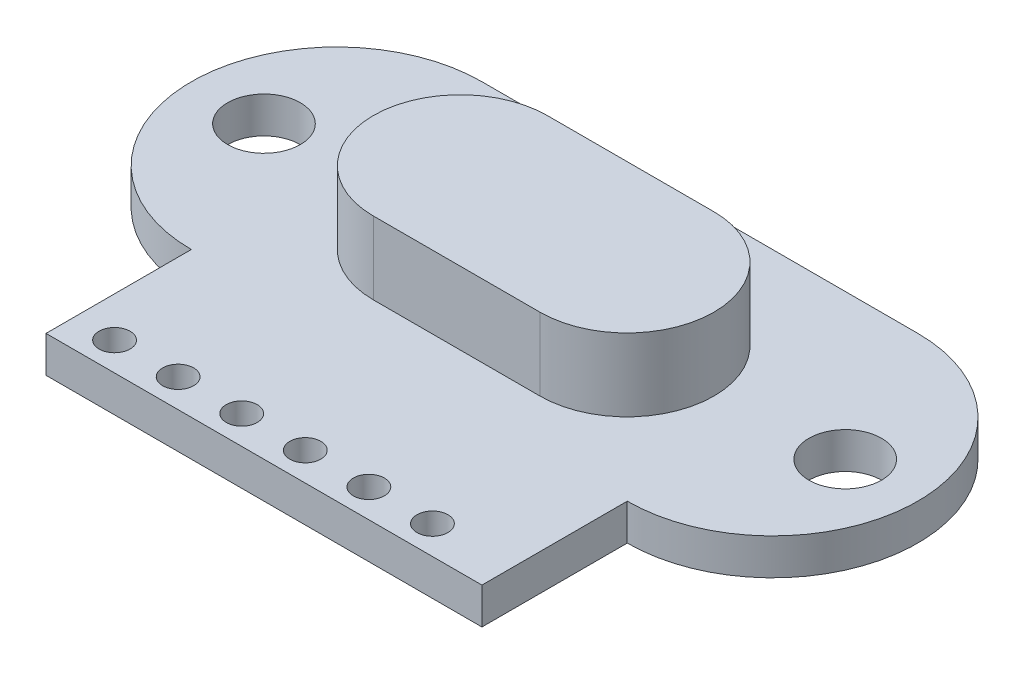
ISO-10303-21;
HEADER;
FILE_DESCRIPTION(('STEP AP214'),'2;1');
FILE_NAME('part.step','',(''),(''),'','','');
FILE_SCHEMA(('AUTOMOTIVE_DESIGN { 1 0 10303 214 1 1 1 1 }'));
ENDSEC;
DATA;
#1=APPLICATION_CONTEXT('core data for automotive mechanical design processes');
#2=APPLICATION_PROTOCOL_DEFINITION('international standard','automotive_design',2000,#1);
#3=PRODUCT_CONTEXT('',#1,'mechanical');
#4=PRODUCT('Part','Part','',(#3));
#5=PRODUCT_RELATED_PRODUCT_CATEGORY('part','',(#4));
#6=PRODUCT_DEFINITION_FORMATION('','',#4);
#7=PRODUCT_DEFINITION_CONTEXT('part definition',#1,'design');
#8=PRODUCT_DEFINITION('design','',#6,#7);
#9=PRODUCT_DEFINITION_SHAPE('','',#8);
#10=(LENGTH_UNIT() NAMED_UNIT(*) SI_UNIT(.MILLI.,.METRE.));
#11=(NAMED_UNIT(*) PLANE_ANGLE_UNIT() SI_UNIT($,.RADIAN.));
#12=(NAMED_UNIT(*) SI_UNIT($,.STERADIAN.) SOLID_ANGLE_UNIT());
#13=UNCERTAINTY_MEASURE_WITH_UNIT(LENGTH_MEASURE(1.E-05),#10,'distance_accuracy_value','');
#14=(GEOMETRIC_REPRESENTATION_CONTEXT(3) GLOBAL_UNCERTAINTY_ASSIGNED_CONTEXT((#13)) GLOBAL_UNIT_ASSIGNED_CONTEXT((#10,
#11,#12)) REPRESENTATION_CONTEXT('',''));
#15=CARTESIAN_POINT('',(0.,0.,0.));
#16=DIRECTION('',(0.,0.,1.));
#17=DIRECTION('',(1.,0.,0.));
#18=AXIS2_PLACEMENT_3D('',#15,#16,#17);
#19=CARTESIAN_POINT('',(-6.,0.,-8.));
#20=DIRECTION('',(0.,1.,0.));
#21=DIRECTION('',(0.,0.,1.));
#22=AXIS2_PLACEMENT_3D('',#19,#20,#21);
#23=PLANE('',#22);
#24=CARTESIAN_POINT('',(-6.,0.,-8.));
#25=DIRECTION('',(0.,1.,0.));
#26=DIRECTION('',(0.,0.,1.));
#27=AXIS2_PLACEMENT_3D('',#24,#25,#26);
#28=CIRCLE('',#27,4.);
#29=CARTESIAN_POINT('',(-6.,0.,-12.));
#30=VERTEX_POINT('',#29);
#31=CARTESIAN_POINT('',(-6.,0.,-4.));
#32=VERTEX_POINT('',#31);
#33=EDGE_CURVE('E264',#30,#32,#28,.T.);
#34=ORIENTED_EDGE('',*,*,#33,.F.);
#35=DIRECTION('',(-1.,0.,0.));
#36=VECTOR('',#35,1.);
#37=CARTESIAN_POINT('',(-6.,0.,-12.));
#38=LINE('',#37,#36);
#39=CARTESIAN_POINT('',(6.,0.,-12.));
#40=VERTEX_POINT('',#39);
#41=EDGE_CURVE('E269',#40,#30,#38,.T.);
#42=ORIENTED_EDGE('',*,*,#41,.F.);
#43=CARTESIAN_POINT('',(6.,0.,-8.));
#44=DIRECTION('',(0.,1.,0.));
#45=DIRECTION('',(0.,0.,1.));
#46=AXIS2_PLACEMENT_3D('',#43,#44,#45);
#47=CIRCLE('',#46,4.);
#48=CARTESIAN_POINT('',(6.,0.,-4.));
#49=VERTEX_POINT('',#48);
#50=EDGE_CURVE('E275',#49,#40,#47,.T.);
#51=ORIENTED_EDGE('',*,*,#50,.F.);
#52=DIRECTION('',(0.,0.,1.));
#53=VECTOR('',#52,1.);
#54=CARTESIAN_POINT('',(6.,0.,-4.));
#55=LINE('',#54,#53);
#56=CARTESIAN_POINT('',(6.,0.,0.));
#57=VERTEX_POINT('',#56);
#58=EDGE_CURVE('E257',#49,#57,#55,.T.);
#59=ORIENTED_EDGE('',*,*,#58,.T.);
#60=DIRECTION('',(-1.,0.,0.));
#61=VECTOR('',#60,1.);
#62=CARTESIAN_POINT('',(-6.,0.,0.));
#63=LINE('',#62,#61);
#64=CARTESIAN_POINT('',(-6.,0.,0.));
#65=VERTEX_POINT('',#64);
#66=EDGE_CURVE('E248',#57,#65,#63,.T.);
#67=ORIENTED_EDGE('',*,*,#66,.T.);
#68=DIRECTION('',(0.,0.,-1.));
#69=VECTOR('',#68,1.);
#70=CARTESIAN_POINT('',(-6.00000000000001,0.,-4.));
#71=LINE('',#70,#69);
#72=EDGE_CURVE('E199',#65,#32,#71,.T.);
#73=ORIENTED_EDGE('',*,*,#72,.T.);
#74=EDGE_LOOP('',(#34,#42,#51,#59,#67,#73));
#75=FACE_BOUND('',#74,.T.);
#76=CARTESIAN_POINT('',(3.85434311331676,0.,-0.783316432222778));
#77=DIRECTION('',(0.,1.,0.));
#78=DIRECTION('',(0.,0.,1.));
#79=AXIS2_PLACEMENT_3D('',#76,#77,#78);
#80=CIRCLE('',#79,0.426779721988132);
#81=CARTESIAN_POINT('',(3.85434311331676,0.,-0.356536710234646));
#82=VERTEX_POINT('',#81);
#83=EDGE_CURVE('E195',#82,#82,#80,.T.);
#84=ORIENTED_EDGE('',*,*,#83,.T.);
#85=EDGE_LOOP('',(#84));
#86=FACE_BOUND('',#85,.T.);
#87=CARTESIAN_POINT('',(2.10434311331675,0.,-0.783316432222778));
#88=DIRECTION('',(0.,1.,0.));
#89=DIRECTION('',(0.,0.,1.));
#90=AXIS2_PLACEMENT_3D('',#87,#88,#89);
#91=CIRCLE('',#90,0.426779721988132);
#92=CARTESIAN_POINT('',(2.10434311331675,0.,-0.356536710234646));
#93=VERTEX_POINT('',#92);
#94=EDGE_CURVE('E236',#93,#93,#91,.T.);
#95=ORIENTED_EDGE('',*,*,#94,.T.);
#96=EDGE_LOOP('',(#95));
#97=FACE_BOUND('',#96,.T.);
#98=CARTESIAN_POINT('',(0.354343113316754,0.,-0.783316432222778));
#99=DIRECTION('',(0.,1.,0.));
#100=DIRECTION('',(0.,0.,1.));
#101=AXIS2_PLACEMENT_3D('',#98,#99,#100);
#102=CIRCLE('',#101,0.426779721988132);
#103=CARTESIAN_POINT('',(0.354343113316754,0.,-0.356536710234646));
#104=VERTEX_POINT('',#103);
#105=EDGE_CURVE('E230',#104,#104,#102,.T.);
#106=ORIENTED_EDGE('',*,*,#105,.T.);
#107=EDGE_LOOP('',(#106));
#108=FACE_BOUND('',#107,.T.);
#109=CARTESIAN_POINT('',(-1.39565688668325,0.,-0.783316432222778));
#110=DIRECTION('',(0.,1.,0.));
#111=DIRECTION('',(0.,0.,1.));
#112=AXIS2_PLACEMENT_3D('',#109,#110,#111);
#113=CIRCLE('',#112,0.426779721988132);
#114=CARTESIAN_POINT('',(-1.39565688668325,0.,-0.356536710234646));
#115=VERTEX_POINT('',#114);
#116=EDGE_CURVE('E224',#115,#115,#113,.T.);
#117=ORIENTED_EDGE('',*,*,#116,.T.);
#118=EDGE_LOOP('',(#117));
#119=FACE_BOUND('',#118,.T.);
#120=CARTESIAN_POINT('',(-3.14565688668325,0.,-0.783316432222778));
#121=DIRECTION('',(0.,1.,0.));
#122=DIRECTION('',(0.,0.,1.));
#123=AXIS2_PLACEMENT_3D('',#120,#121,#122);
#124=CIRCLE('',#123,0.426779721988132);
#125=CARTESIAN_POINT('',(-3.14565688668325,0.,-0.356536710234646));
#126=VERTEX_POINT('',#125);
#127=EDGE_CURVE('E218',#126,#126,#124,.T.);
#128=ORIENTED_EDGE('',*,*,#127,.T.);
#129=EDGE_LOOP('',(#128));
#130=FACE_BOUND('',#129,.T.);
#131=CARTESIAN_POINT('',(-4.89565688668325,0.,-0.783316432222778));
#132=DIRECTION('',(0.,1.,0.));
#133=DIRECTION('',(0.,0.,1.));
#134=AXIS2_PLACEMENT_3D('',#131,#132,#133);
#135=CIRCLE('',#134,0.426779721988132);
#136=CARTESIAN_POINT('',(-4.89565688668325,0.,-0.356536710234646));
#137=VERTEX_POINT('',#136);
#138=EDGE_CURVE('E212',#137,#137,#135,.T.);
#139=ORIENTED_EDGE('',*,*,#138,.T.);
#140=EDGE_LOOP('',(#139));
#141=FACE_BOUND('',#140,.T.);
#142=CARTESIAN_POINT('',(-8.,0.,-8.));
#143=DIRECTION('',(0.,1.,0.));
#144=DIRECTION('',(0.,0.,1.));
#145=AXIS2_PLACEMENT_3D('',#142,#143,#144);
#146=CIRCLE('',#145,1.);
#147=CARTESIAN_POINT('',(-8.,0.,-7.));
#148=VERTEX_POINT('',#147);
#149=EDGE_CURVE('E206',#148,#148,#146,.T.);
#150=ORIENTED_EDGE('',*,*,#149,.T.);
#151=EDGE_LOOP('',(#150));
#152=FACE_BOUND('',#151,.T.);
#153=CARTESIAN_POINT('',(8.,0.,-8.));
#154=DIRECTION('',(0.,1.,0.));
#155=DIRECTION('',(0.,0.,1.));
#156=AXIS2_PLACEMENT_3D('',#153,#154,#155);
#157=CIRCLE('',#156,1.);
#158=CARTESIAN_POINT('',(8.,0.,-7.));
#159=VERTEX_POINT('',#158);
#160=EDGE_CURVE('E196',#159,#159,#157,.T.);
#161=ORIENTED_EDGE('',*,*,#160,.T.);
#162=EDGE_LOOP('',(#161));
#163=FACE_BOUND('',#162,.T.);
#164=DIRECTION('',(0.,0.,-1.));
#165=VECTOR('',#164,1.);
#166=CARTESIAN_POINT('',(-4.40074075333002,0.,-4.28785770083208));
#167=LINE('',#166,#165);
#168=CARTESIAN_POINT('',(-4.40074075333002,0.,-4.28785770083208));
#169=VERTEX_POINT('',#168);
#170=CARTESIAN_POINT('',(-4.40074075333002,0.,-9.61155016230731));
#171=VERTEX_POINT('',#170);
#172=EDGE_CURVE('E160',#169,#171,#167,.T.);
#173=ORIENTED_EDGE('',*,*,#172,.F.);
#174=DIRECTION('',(-1.,0.,0.));
#175=VECTOR('',#174,1.);
#176=CARTESIAN_POINT('',(-4.40074075333002,0.,-4.28785770083208));
#177=LINE('',#176,#175);
#178=CARTESIAN_POINT('',(4.14659463079729,0.,-4.28785770083208));
#179=VERTEX_POINT('',#178);
#180=EDGE_CURVE('E157',#179,#169,#177,.T.);
#181=ORIENTED_EDGE('',*,*,#180,.F.);
#182=DIRECTION('',(0.,0.,1.));
#183=VECTOR('',#182,1.);
#184=CARTESIAN_POINT('',(4.14659463079729,0.,-4.28785770083208));
#185=LINE('',#184,#183);
#186=CARTESIAN_POINT('',(4.14659463079729,0.,-9.61155016230731));
#187=VERTEX_POINT('',#186);
#188=EDGE_CURVE('E59',#187,#179,#185,.T.);
#189=ORIENTED_EDGE('',*,*,#188,.F.);
#190=DIRECTION('',(1.,0.,0.));
#191=VECTOR('',#190,1.);
#192=CARTESIAN_POINT('',(-4.40074075333002,0.,-9.61155016230731));
#193=LINE('',#192,#191);
#194=EDGE_CURVE('E54',#171,#187,#193,.T.);
#195=ORIENTED_EDGE('',*,*,#194,.F.);
#196=EDGE_LOOP('',(#173,#181,#189,#195));
#197=FACE_BOUND('',#196,.T.);
#198=ADVANCED_FACE('F39',(#75,#86,#97,#108,#119,#130,#141,#152,#163,#197),#23,.F.);
#199=CARTESIAN_POINT('',(-6.,1.,-8.));
#200=DIRECTION('',(0.,1.,0.));
#201=DIRECTION('',(0.,0.,1.));
#202=AXIS2_PLACEMENT_3D('',#199,#200,#201);
#203=PLANE('',#202);
#204=CARTESIAN_POINT('',(8.,1.,-8.));
#205=DIRECTION('',(0.,1.,0.));
#206=DIRECTION('',(0.,0.,1.));
#207=AXIS2_PLACEMENT_3D('',#204,#205,#206);
#208=CIRCLE('',#207,1.);
#209=CARTESIAN_POINT('',(8.,1.,-7.));
#210=VERTEX_POINT('',#209);
#211=EDGE_CURVE('E200',#210,#210,#208,.T.);
#212=ORIENTED_EDGE('',*,*,#211,.F.);
#213=EDGE_LOOP('',(#212));
#214=FACE_BOUND('',#213,.T.);
#215=CARTESIAN_POINT('',(-8.,1.,-8.));
#216=DIRECTION('',(0.,1.,0.));
#217=DIRECTION('',(0.,0.,1.));
#218=AXIS2_PLACEMENT_3D('',#215,#216,#217);
#219=CIRCLE('',#218,1.);
#220=CARTESIAN_POINT('',(-8.,1.,-7.));
#221=VERTEX_POINT('',#220);
#222=EDGE_CURVE('E203',#221,#221,#219,.T.);
#223=ORIENTED_EDGE('',*,*,#222,.F.);
#224=EDGE_LOOP('',(#223));
#225=FACE_BOUND('',#224,.T.);
#226=CARTESIAN_POINT('',(-4.89565688668325,1.,-0.783316432222778));
#227=DIRECTION('',(0.,1.,0.));
#228=DIRECTION('',(0.,0.,1.));
#229=AXIS2_PLACEMENT_3D('',#226,#227,#228);
#230=CIRCLE('',#229,0.426779721988132);
#231=CARTESIAN_POINT('',(-4.89565688668325,1.,-0.356536710234646));
#232=VERTEX_POINT('',#231);
#233=EDGE_CURVE('E209',#232,#232,#230,.T.);
#234=ORIENTED_EDGE('',*,*,#233,.F.);
#235=EDGE_LOOP('',(#234));
#236=FACE_BOUND('',#235,.T.);
#237=CARTESIAN_POINT('',(-3.14565688668325,1.,-0.783316432222778));
#238=DIRECTION('',(0.,1.,0.));
#239=DIRECTION('',(0.,0.,1.));
#240=AXIS2_PLACEMENT_3D('',#237,#238,#239);
#241=CIRCLE('',#240,0.426779721988132);
#242=CARTESIAN_POINT('',(-3.14565688668325,1.,-0.356536710234646));
#243=VERTEX_POINT('',#242);
#244=EDGE_CURVE('E215',#243,#243,#241,.T.);
#245=ORIENTED_EDGE('',*,*,#244,.F.);
#246=EDGE_LOOP('',(#245));
#247=FACE_BOUND('',#246,.T.);
#248=CARTESIAN_POINT('',(-1.39565688668325,1.,-0.783316432222778));
#249=DIRECTION('',(0.,1.,0.));
#250=DIRECTION('',(0.,0.,1.));
#251=AXIS2_PLACEMENT_3D('',#248,#249,#250);
#252=CIRCLE('',#251,0.426779721988132);
#253=CARTESIAN_POINT('',(-1.39565688668325,1.,-0.356536710234646));
#254=VERTEX_POINT('',#253);
#255=EDGE_CURVE('E221',#254,#254,#252,.T.);
#256=ORIENTED_EDGE('',*,*,#255,.F.);
#257=EDGE_LOOP('',(#256));
#258=FACE_BOUND('',#257,.T.);
#259=CARTESIAN_POINT('',(0.354343113316754,1.,-0.783316432222778));
#260=DIRECTION('',(0.,1.,0.));
#261=DIRECTION('',(0.,0.,1.));
#262=AXIS2_PLACEMENT_3D('',#259,#260,#261);
#263=CIRCLE('',#262,0.426779721988132);
#264=CARTESIAN_POINT('',(0.354343113316754,1.,-0.356536710234646));
#265=VERTEX_POINT('',#264);
#266=EDGE_CURVE('E227',#265,#265,#263,.T.);
#267=ORIENTED_EDGE('',*,*,#266,.F.);
#268=EDGE_LOOP('',(#267));
#269=FACE_BOUND('',#268,.T.);
#270=CARTESIAN_POINT('',(2.10434311331675,1.,-0.783316432222778));
#271=DIRECTION('',(0.,1.,0.));
#272=DIRECTION('',(0.,0.,1.));
#273=AXIS2_PLACEMENT_3D('',#270,#271,#272);
#274=CIRCLE('',#273,0.426779721988132);
#275=CARTESIAN_POINT('',(2.10434311331675,1.,-0.356536710234646));
#276=VERTEX_POINT('',#275);
#277=EDGE_CURVE('E233',#276,#276,#274,.T.);
#278=ORIENTED_EDGE('',*,*,#277,.F.);
#279=EDGE_LOOP('',(#278));
#280=FACE_BOUND('',#279,.T.);
#281=CARTESIAN_POINT('',(3.85434311331676,1.,-0.783316432222778));
#282=DIRECTION('',(0.,1.,0.));
#283=DIRECTION('',(0.,0.,1.));
#284=AXIS2_PLACEMENT_3D('',#281,#282,#283);
#285=CIRCLE('',#284,0.426779721988132);
#286=CARTESIAN_POINT('',(3.85434311331676,1.,-0.356536710234646));
#287=VERTEX_POINT('',#286);
#288=EDGE_CURVE('E239',#287,#287,#285,.T.);
#289=ORIENTED_EDGE('',*,*,#288,.F.);
#290=EDGE_LOOP('',(#289));
#291=FACE_BOUND('',#290,.T.);
#292=CARTESIAN_POINT('',(-6.,1.,-8.));
#293=DIRECTION('',(0.,1.,0.));
#294=DIRECTION('',(0.,0.,1.));
#295=AXIS2_PLACEMENT_3D('',#292,#293,#294);
#296=CIRCLE('',#295,4.);
#297=CARTESIAN_POINT('',(-6.,1.,-12.));
#298=VERTEX_POINT('',#297);
#299=CARTESIAN_POINT('',(-6.,1.,-4.));
#300=VERTEX_POINT('',#299);
#301=EDGE_CURVE('E266',#298,#300,#296,.T.);
#302=ORIENTED_EDGE('',*,*,#301,.T.);
#303=DIRECTION('',(0.,0.,-1.));
#304=VECTOR('',#303,1.);
#305=CARTESIAN_POINT('',(-6.00000000000001,1.,-4.));
#306=LINE('',#305,#304);
#307=CARTESIAN_POINT('',(-6.,1.,0.));
#308=VERTEX_POINT('',#307);
#309=EDGE_CURVE('E244',#308,#300,#306,.T.);
#310=ORIENTED_EDGE('',*,*,#309,.F.);
#311=DIRECTION('',(-1.,0.,0.));
#312=VECTOR('',#311,1.);
#313=CARTESIAN_POINT('',(-6.,1.,0.));
#314=LINE('',#313,#312);
#315=CARTESIAN_POINT('',(6.,1.,0.));
#316=VERTEX_POINT('',#315);
#317=EDGE_CURVE('E251',#316,#308,#314,.T.);
#318=ORIENTED_EDGE('',*,*,#317,.F.);
#319=DIRECTION('',(0.,0.,1.));
#320=VECTOR('',#319,1.);
#321=CARTESIAN_POINT('',(6.,1.,-4.));
#322=LINE('',#321,#320);
#323=CARTESIAN_POINT('',(6.,1.,-4.));
#324=VERTEX_POINT('',#323);
#325=EDGE_CURVE('E247',#324,#316,#322,.T.);
#326=ORIENTED_EDGE('',*,*,#325,.F.);
#327=CARTESIAN_POINT('',(6.,1.,-8.));
#328=DIRECTION('',(0.,1.,0.));
#329=DIRECTION('',(0.,0.,1.));
#330=AXIS2_PLACEMENT_3D('',#327,#328,#329);
#331=CIRCLE('',#330,4.);
#332=CARTESIAN_POINT('',(6.,1.,-12.));
#333=VERTEX_POINT('',#332);
#334=EDGE_CURVE('E268',#324,#333,#331,.T.);
#335=ORIENTED_EDGE('',*,*,#334,.T.);
#336=DIRECTION('',(-1.,0.,0.));
#337=VECTOR('',#336,1.);
#338=CARTESIAN_POINT('',(-6.,1.,-12.));
#339=LINE('',#338,#337);
#340=EDGE_CURVE('E271',#333,#298,#339,.T.);
#341=ORIENTED_EDGE('',*,*,#340,.T.);
#342=EDGE_LOOP('',(#302,#310,#318,#326,#335,#341));
#343=FACE_BOUND('',#342,.T.);
#344=DIRECTION('',(1.,0.,0.));
#345=VECTOR('',#344,1.);
#346=CARTESIAN_POINT('',(-2.29400315865076,1.,-5.30444219096305));
#347=LINE('',#346,#345);
#348=CARTESIAN_POINT('',(-2.29400315865076,1.,-5.30444219096305));
#349=VERTEX_POINT('',#348);
#350=CARTESIAN_POINT('',(2.29400315865076,1.,-5.30444219096305));
#351=VERTEX_POINT('',#350);
#352=EDGE_CURVE('E164',#349,#351,#347,.T.);
#353=ORIENTED_EDGE('',*,*,#352,.F.);
#354=CARTESIAN_POINT('',(-2.29400315865076,1.,-7.69876618745567));
#355=DIRECTION('',(0.,1.,0.));
#356=DIRECTION('',(0.,0.,1.));
#357=AXIS2_PLACEMENT_3D('',#354,#355,#356);
#358=CIRCLE('',#357,2.39432399649262);
#359=CARTESIAN_POINT('',(-2.29400315865076,1.,-10.0930901839483));
#360=VERTEX_POINT('',#359);
#361=EDGE_CURVE('E161',#360,#349,#358,.T.);
#362=ORIENTED_EDGE('',*,*,#361,.F.);
#363=DIRECTION('',(-1.,0.,0.));
#364=VECTOR('',#363,1.);
#365=CARTESIAN_POINT('',(-2.29400315865076,1.,-10.0930901839483));
#366=LINE('',#365,#364);
#367=CARTESIAN_POINT('',(2.29400315865076,1.,-10.0930901839483));
#368=VERTEX_POINT('',#367);
#369=EDGE_CURVE('E174',#368,#360,#366,.T.);
#370=ORIENTED_EDGE('',*,*,#369,.F.);
#371=CARTESIAN_POINT('',(2.29400315865076,1.,-7.69876618745567));
#372=DIRECTION('',(0.,1.,0.));
#373=DIRECTION('',(0.,0.,1.));
#374=AXIS2_PLACEMENT_3D('',#371,#372,#373);
#375=CIRCLE('',#374,2.39432399649262);
#376=EDGE_CURVE('E182',#351,#368,#375,.T.);
#377=ORIENTED_EDGE('',*,*,#376,.F.);
#378=EDGE_LOOP('',(#353,#362,#370,#377));
#379=FACE_BOUND('',#378,.T.);
#380=ADVANCED_FACE('F311',(#214,#225,#236,#247,#258,#269,#280,#291,#343,#379),#203,.T.);
#381=CARTESIAN_POINT('',(-6.,1.,-8.));
#382=DIRECTION('',(0.,-1.,0.));
#383=DIRECTION('',(0.,0.,-1.));
#384=AXIS2_PLACEMENT_3D('',#381,#382,#383);
#385=CYLINDRICAL_SURFACE('',#384,4.);
#386=ORIENTED_EDGE('',*,*,#33,.T.);
#387=DIRECTION('',(0.,-1.,0.));
#388=VECTOR('',#387,1.);
#389=CARTESIAN_POINT('',(-6.,1.,-4.));
#390=LINE('',#389,#388);
#391=EDGE_CURVE('E11',#300,#32,#390,.T.);
#392=ORIENTED_EDGE('',*,*,#391,.F.);
#393=ORIENTED_EDGE('',*,*,#301,.F.);
#394=DIRECTION('',(0.,-1.,0.));
#395=VECTOR('',#394,1.);
#396=CARTESIAN_POINT('',(-6.,1.,-12.));
#397=LINE('',#396,#395);
#398=EDGE_CURVE('E273',#298,#30,#397,.T.);
#399=ORIENTED_EDGE('',*,*,#398,.T.);
#400=EDGE_LOOP('',(#386,#392,#393,#399));
#401=FACE_BOUND('',#400,.T.);
#402=ADVANCED_FACE('F41',(#401),#385,.T.);
#403=CARTESIAN_POINT('',(6.,1.,-8.));
#404=DIRECTION('',(0.,-1.,0.));
#405=DIRECTION('',(0.,0.,-1.));
#406=AXIS2_PLACEMENT_3D('',#403,#404,#405);
#407=CYLINDRICAL_SURFACE('',#406,4.);
#408=ORIENTED_EDGE('',*,*,#50,.T.);
#409=DIRECTION('',(0.,-1.,0.));
#410=VECTOR('',#409,1.);
#411=CARTESIAN_POINT('',(6.,1.,-12.));
#412=LINE('',#411,#410);
#413=EDGE_CURVE('E280',#333,#40,#412,.T.);
#414=ORIENTED_EDGE('',*,*,#413,.F.);
#415=ORIENTED_EDGE('',*,*,#334,.F.);
#416=DIRECTION('',(0.,-1.,0.));
#417=VECTOR('',#416,1.);
#418=CARTESIAN_POINT('',(6.,1.,-4.));
#419=LINE('',#418,#417);
#420=EDGE_CURVE('E47',#324,#49,#419,.T.);
#421=ORIENTED_EDGE('',*,*,#420,.T.);
#422=EDGE_LOOP('',(#408,#414,#415,#421));
#423=FACE_BOUND('',#422,.T.);
#424=ADVANCED_FACE('F286',(#423),#407,.T.);
#425=CARTESIAN_POINT('',(-6.,1.,-12.));
#426=DIRECTION('',(0.,0.,1.));
#427=DIRECTION('',(1.,0.,0.));
#428=AXIS2_PLACEMENT_3D('',#425,#426,#427);
#429=PLANE('',#428);
#430=ORIENTED_EDGE('',*,*,#41,.T.);
#431=ORIENTED_EDGE('',*,*,#398,.F.);
#432=ORIENTED_EDGE('',*,*,#340,.F.);
#433=ORIENTED_EDGE('',*,*,#413,.T.);
#434=EDGE_LOOP('',(#430,#431,#432,#433));
#435=FACE_BOUND('',#434,.T.);
#436=ADVANCED_FACE('F309',(#435),#429,.F.);
#437=CARTESIAN_POINT('',(-6.00000000000001,1.,-4.));
#438=DIRECTION('',(-1.,0.,0.));
#439=DIRECTION('',(0.,0.,1.));
#440=AXIS2_PLACEMENT_3D('',#437,#438,#439);
#441=PLANE('',#440);
#442=ORIENTED_EDGE('',*,*,#72,.F.);
#443=DIRECTION('',(0.,-1.,0.));
#444=VECTOR('',#443,1.);
#445=CARTESIAN_POINT('',(-6.,1.,0.));
#446=LINE('',#445,#444);
#447=EDGE_CURVE('E262',#308,#65,#446,.T.);
#448=ORIENTED_EDGE('',*,*,#447,.F.);
#449=ORIENTED_EDGE('',*,*,#309,.T.);
#450=ORIENTED_EDGE('',*,*,#391,.T.);
#451=EDGE_LOOP('',(#442,#448,#449,#450));
#452=FACE_BOUND('',#451,.T.);
#453=ADVANCED_FACE('F302',(#452),#441,.T.);
#454=CARTESIAN_POINT('',(-6.,1.,0.));
#455=DIRECTION('',(0.,0.,1.));
#456=DIRECTION('',(1.,0.,0.));
#457=AXIS2_PLACEMENT_3D('',#454,#455,#456);
#458=PLANE('',#457);
#459=ORIENTED_EDGE('',*,*,#66,.F.);
#460=DIRECTION('',(0.,-1.,0.));
#461=VECTOR('',#460,1.);
#462=CARTESIAN_POINT('',(6.,1.,0.));
#463=LINE('',#462,#461);
#464=EDGE_CURVE('E254',#316,#57,#463,.T.);
#465=ORIENTED_EDGE('',*,*,#464,.F.);
#466=ORIENTED_EDGE('',*,*,#317,.T.);
#467=ORIENTED_EDGE('',*,*,#447,.T.);
#468=EDGE_LOOP('',(#459,#465,#466,#467));
#469=FACE_BOUND('',#468,.T.);
#470=ADVANCED_FACE('F297',(#469),#458,.T.);
#471=CARTESIAN_POINT('',(6.,1.,-4.));
#472=DIRECTION('',(1.,0.,0.));
#473=DIRECTION('',(0.,0.,-1.));
#474=AXIS2_PLACEMENT_3D('',#471,#472,#473);
#475=PLANE('',#474);
#476=ORIENTED_EDGE('',*,*,#58,.F.);
#477=ORIENTED_EDGE('',*,*,#420,.F.);
#478=ORIENTED_EDGE('',*,*,#325,.T.);
#479=ORIENTED_EDGE('',*,*,#464,.T.);
#480=EDGE_LOOP('',(#476,#477,#478,#479));
#481=FACE_BOUND('',#480,.T.);
#482=ADVANCED_FACE('F290',(#481),#475,.T.);
#483=CARTESIAN_POINT('',(3.85434311331676,0.,-0.783316432222778));
#484=DIRECTION('',(0.,1.,0.));
#485=DIRECTION('',(0.,0.,1.));
#486=AXIS2_PLACEMENT_3D('',#483,#484,#485);
#487=CYLINDRICAL_SURFACE('',#486,0.426779721988132);
#488=ORIENTED_EDGE('',*,*,#83,.F.);
#489=EDGE_LOOP('',(#488));
#490=FACE_BOUND('',#489,.T.);
#491=ORIENTED_EDGE('',*,*,#288,.T.);
#492=EDGE_LOOP('',(#491));
#493=FACE_BOUND('',#492,.T.);
#494=ADVANCED_FACE('F516',(#490,#493),#487,.F.);
#495=CARTESIAN_POINT('',(2.10434311331675,0.,-0.783316432222778));
#496=DIRECTION('',(0.,1.,0.));
#497=DIRECTION('',(0.,0.,1.));
#498=AXIS2_PLACEMENT_3D('',#495,#496,#497);
#499=CYLINDRICAL_SURFACE('',#498,0.426779721988132);
#500=ORIENTED_EDGE('',*,*,#94,.F.);
#501=EDGE_LOOP('',(#500));
#502=FACE_BOUND('',#501,.T.);
#503=ORIENTED_EDGE('',*,*,#277,.T.);
#504=EDGE_LOOP('',(#503));
#505=FACE_BOUND('',#504,.T.);
#506=ADVANCED_FACE('F512',(#502,#505),#499,.F.);
#507=CARTESIAN_POINT('',(0.354343113316754,0.,-0.783316432222778));
#508=DIRECTION('',(0.,1.,0.));
#509=DIRECTION('',(0.,0.,1.));
#510=AXIS2_PLACEMENT_3D('',#507,#508,#509);
#511=CYLINDRICAL_SURFACE('',#510,0.426779721988132);
#512=ORIENTED_EDGE('',*,*,#105,.F.);
#513=EDGE_LOOP('',(#512));
#514=FACE_BOUND('',#513,.T.);
#515=ORIENTED_EDGE('',*,*,#266,.T.);
#516=EDGE_LOOP('',(#515));
#517=FACE_BOUND('',#516,.T.);
#518=ADVANCED_FACE('F508',(#514,#517),#511,.F.);
#519=CARTESIAN_POINT('',(-1.39565688668325,0.,-0.783316432222778));
#520=DIRECTION('',(0.,1.,0.));
#521=DIRECTION('',(0.,0.,1.));
#522=AXIS2_PLACEMENT_3D('',#519,#520,#521);
#523=CYLINDRICAL_SURFACE('',#522,0.426779721988132);
#524=ORIENTED_EDGE('',*,*,#116,.F.);
#525=EDGE_LOOP('',(#524));
#526=FACE_BOUND('',#525,.T.);
#527=ORIENTED_EDGE('',*,*,#255,.T.);
#528=EDGE_LOOP('',(#527));
#529=FACE_BOUND('',#528,.T.);
#530=ADVANCED_FACE('F504',(#526,#529),#523,.F.);
#531=CARTESIAN_POINT('',(-3.14565688668325,0.,-0.783316432222778));
#532=DIRECTION('',(0.,1.,0.));
#533=DIRECTION('',(0.,0.,1.));
#534=AXIS2_PLACEMENT_3D('',#531,#532,#533);
#535=CYLINDRICAL_SURFACE('',#534,0.426779721988132);
#536=ORIENTED_EDGE('',*,*,#127,.F.);
#537=EDGE_LOOP('',(#536));
#538=FACE_BOUND('',#537,.T.);
#539=ORIENTED_EDGE('',*,*,#244,.T.);
#540=EDGE_LOOP('',(#539));
#541=FACE_BOUND('',#540,.T.);
#542=ADVANCED_FACE('F500',(#538,#541),#535,.F.);
#543=CARTESIAN_POINT('',(-4.89565688668325,0.,-0.783316432222778));
#544=DIRECTION('',(0.,1.,0.));
#545=DIRECTION('',(0.,0.,1.));
#546=AXIS2_PLACEMENT_3D('',#543,#544,#545);
#547=CYLINDRICAL_SURFACE('',#546,0.426779721988132);
#548=ORIENTED_EDGE('',*,*,#138,.F.);
#549=EDGE_LOOP('',(#548));
#550=FACE_BOUND('',#549,.T.);
#551=ORIENTED_EDGE('',*,*,#233,.T.);
#552=EDGE_LOOP('',(#551));
#553=FACE_BOUND('',#552,.T.);
#554=ADVANCED_FACE('F496',(#550,#553),#547,.F.);
#555=CARTESIAN_POINT('',(-8.,0.,-8.));
#556=DIRECTION('',(0.,1.,0.));
#557=DIRECTION('',(0.,0.,1.));
#558=AXIS2_PLACEMENT_3D('',#555,#556,#557);
#559=CYLINDRICAL_SURFACE('',#558,1.);
#560=ORIENTED_EDGE('',*,*,#149,.F.);
#561=EDGE_LOOP('',(#560));
#562=FACE_BOUND('',#561,.T.);
#563=ORIENTED_EDGE('',*,*,#222,.T.);
#564=EDGE_LOOP('',(#563));
#565=FACE_BOUND('',#564,.T.);
#566=ADVANCED_FACE('F492',(#562,#565),#559,.F.);
#567=CARTESIAN_POINT('',(8.,0.,-8.));
#568=DIRECTION('',(0.,1.,0.));
#569=DIRECTION('',(0.,0.,1.));
#570=AXIS2_PLACEMENT_3D('',#567,#568,#569);
#571=CYLINDRICAL_SURFACE('',#570,1.);
#572=ORIENTED_EDGE('',*,*,#160,.F.);
#573=EDGE_LOOP('',(#572));
#574=FACE_BOUND('',#573,.T.);
#575=ORIENTED_EDGE('',*,*,#211,.T.);
#576=EDGE_LOOP('',(#575));
#577=FACE_BOUND('',#576,.T.);
#578=ADVANCED_FACE('F371',(#574,#577),#571,.F.);
#579=CARTESIAN_POINT('',(-2.29400315865076,3.,-7.69876618745567));
#580=DIRECTION('',(0.,-1.,0.));
#581=DIRECTION('',(0.,0.,-1.));
#582=AXIS2_PLACEMENT_3D('',#579,#580,#581);
#583=CYLINDRICAL_SURFACE('',#582,2.39432399649262);
#584=ORIENTED_EDGE('',*,*,#361,.T.);
#585=DIRECTION('',(0.,-1.,0.));
#586=VECTOR('',#585,1.);
#587=CARTESIAN_POINT('',(-2.29400315865076,3.,-5.30444219096305));
#588=LINE('',#587,#586);
#589=CARTESIAN_POINT('',(-2.29400315865076,3.,-5.30444219096305));
#590=VERTEX_POINT('',#589);
#591=EDGE_CURVE('E193',#590,#349,#588,.T.);
#592=ORIENTED_EDGE('',*,*,#591,.F.);
#593=CARTESIAN_POINT('',(-2.29400315865076,3.,-7.69876618745567));
#594=DIRECTION('',(0.,1.,0.));
#595=DIRECTION('',(0.,0.,1.));
#596=AXIS2_PLACEMENT_3D('',#593,#594,#595);
#597=CIRCLE('',#596,2.39432399649262);
#598=CARTESIAN_POINT('',(-2.29400315865076,3.,-10.0930901839483));
#599=VERTEX_POINT('',#598);
#600=EDGE_CURVE('E170',#599,#590,#597,.T.);
#601=ORIENTED_EDGE('',*,*,#600,.F.);
#602=DIRECTION('',(0.,-1.,0.));
#603=VECTOR('',#602,1.);
#604=CARTESIAN_POINT('',(-2.29400315865076,3.,-10.0930901839483));
#605=LINE('',#604,#603);
#606=EDGE_CURVE('E179',#599,#360,#605,.T.);
#607=ORIENTED_EDGE('',*,*,#606,.T.);
#608=EDGE_LOOP('',(#584,#592,#601,#607));
#609=FACE_BOUND('',#608,.T.);
#610=ADVANCED_FACE('F334',(#609),#583,.T.);
#611=CARTESIAN_POINT('',(-2.29400315865076,3.,-5.30444219096305));
#612=DIRECTION('',(0.,0.,-1.));
#613=DIRECTION('',(-1.,0.,0.));
#614=AXIS2_PLACEMENT_3D('',#611,#612,#613);
#615=PLANE('',#614);
#616=ORIENTED_EDGE('',*,*,#352,.T.);
#617=DIRECTION('',(0.,-1.,0.));
#618=VECTOR('',#617,1.);
#619=CARTESIAN_POINT('',(2.29400315865076,3.,-5.30444219096305));
#620=LINE('',#619,#618);
#621=CARTESIAN_POINT('',(2.29400315865076,3.,-5.30444219096305));
#622=VERTEX_POINT('',#621);
#623=EDGE_CURVE('E190',#622,#351,#620,.T.);
#624=ORIENTED_EDGE('',*,*,#623,.F.);
#625=DIRECTION('',(1.,0.,0.));
#626=VECTOR('',#625,1.);
#627=CARTESIAN_POINT('',(-2.29400315865076,3.,-5.30444219096305));
#628=LINE('',#627,#626);
#629=EDGE_CURVE('E173',#590,#622,#628,.T.);
#630=ORIENTED_EDGE('',*,*,#629,.F.);
#631=ORIENTED_EDGE('',*,*,#591,.T.);
#632=EDGE_LOOP('',(#616,#624,#630,#631));
#633=FACE_BOUND('',#632,.T.);
#634=ADVANCED_FACE('F322',(#633),#615,.F.);
#635=CARTESIAN_POINT('',(2.29400315865076,3.,-7.69876618745567));
#636=DIRECTION('',(0.,-1.,0.));
#637=DIRECTION('',(0.,0.,-1.));
#638=AXIS2_PLACEMENT_3D('',#635,#636,#637);
#639=CYLINDRICAL_SURFACE('',#638,2.39432399649262);
#640=ORIENTED_EDGE('',*,*,#376,.T.);
#641=DIRECTION('',(0.,-1.,0.));
#642=VECTOR('',#641,1.);
#643=CARTESIAN_POINT('',(2.29400315865076,3.,-10.0930901839483));
#644=LINE('',#643,#642);
#645=CARTESIAN_POINT('',(2.29400315865076,3.,-10.0930901839483));
#646=VERTEX_POINT('',#645);
#647=EDGE_CURVE('E188',#646,#368,#644,.T.);
#648=ORIENTED_EDGE('',*,*,#647,.F.);
#649=CARTESIAN_POINT('',(2.29400315865076,3.,-7.69876618745567));
#650=DIRECTION('',(0.,1.,0.));
#651=DIRECTION('',(0.,0.,1.));
#652=AXIS2_PLACEMENT_3D('',#649,#650,#651);
#653=CIRCLE('',#652,2.39432399649262);
#654=EDGE_CURVE('E176',#622,#646,#653,.T.);
#655=ORIENTED_EDGE('',*,*,#654,.F.);
#656=ORIENTED_EDGE('',*,*,#623,.T.);
#657=EDGE_LOOP('',(#640,#648,#655,#656));
#658=FACE_BOUND('',#657,.T.);
#659=ADVANCED_FACE('F326',(#658),#639,.T.);
#660=CARTESIAN_POINT('',(-2.29400315865076,3.,-10.0930901839483));
#661=DIRECTION('',(0.,0.,1.));
#662=DIRECTION('',(1.,0.,0.));
#663=AXIS2_PLACEMENT_3D('',#660,#661,#662);
#664=PLANE('',#663);
#665=ORIENTED_EDGE('',*,*,#369,.T.);
#666=ORIENTED_EDGE('',*,*,#606,.F.);
#667=DIRECTION('',(-1.,0.,0.));
#668=VECTOR('',#667,1.);
#669=CARTESIAN_POINT('',(-2.29400315865076,3.,-10.0930901839483));
#670=LINE('',#669,#668);
#671=EDGE_CURVE('E178',#646,#599,#670,.T.);
#672=ORIENTED_EDGE('',*,*,#671,.F.);
#673=ORIENTED_EDGE('',*,*,#647,.T.);
#674=EDGE_LOOP('',(#665,#666,#672,#673));
#675=FACE_BOUND('',#674,.T.);
#676=ADVANCED_FACE('F336',(#675),#664,.F.);
#677=CARTESIAN_POINT('',(-2.29400315865076,3.,-7.69876618745567));
#678=DIRECTION('',(0.,1.,0.));
#679=DIRECTION('',(0.,0.,1.));
#680=AXIS2_PLACEMENT_3D('',#677,#678,#679);
#681=PLANE('',#680);
#682=ORIENTED_EDGE('',*,*,#600,.T.);
#683=ORIENTED_EDGE('',*,*,#629,.T.);
#684=ORIENTED_EDGE('',*,*,#654,.T.);
#685=ORIENTED_EDGE('',*,*,#671,.T.);
#686=EDGE_LOOP('',(#682,#683,#684,#685));
#687=FACE_BOUND('',#686,.T.);
#688=ADVANCED_FACE('F330',(#687),#681,.T.);
#689=CARTESIAN_POINT('',(-4.40074075333002,-1.,-4.28785770083208));
#690=DIRECTION('',(1.,0.,0.));
#691=DIRECTION('',(0.,0.,-1.));
#692=AXIS2_PLACEMENT_3D('',#689,#690,#691);
#693=PLANE('',#692);
#694=ORIENTED_EDGE('',*,*,#172,.T.);
#695=DIRECTION('',(0.,1.,0.));
#696=VECTOR('',#695,1.);
#697=CARTESIAN_POINT('',(-4.40074075333002,-1.,-9.61155016230731));
#698=LINE('',#697,#696);
#699=CARTESIAN_POINT('',(-4.40074075333002,-1.,-9.61155016230731));
#700=VERTEX_POINT('',#699);
#701=EDGE_CURVE('E141',#700,#171,#698,.T.);
#702=ORIENTED_EDGE('',*,*,#701,.F.);
#703=DIRECTION('',(0.,0.,-1.));
#704=VECTOR('',#703,1.);
#705=CARTESIAN_POINT('',(-4.40074075333002,-1.,-4.28785770083208));
#706=LINE('',#705,#704);
#707=CARTESIAN_POINT('',(-4.40074075333002,-1.,-4.28785770083208));
#708=VERTEX_POINT('',#707);
#709=EDGE_CURVE('E148',#708,#700,#706,.T.);
#710=ORIENTED_EDGE('',*,*,#709,.F.);
#711=DIRECTION('',(0.,1.,0.));
#712=VECTOR('',#711,1.);
#713=CARTESIAN_POINT('',(-4.40074075333002,-1.,-4.28785770083208));
#714=LINE('',#713,#712);
#715=EDGE_CURVE('E472',#708,#169,#714,.T.);
#716=ORIENTED_EDGE('',*,*,#715,.T.);
#717=EDGE_LOOP('',(#694,#702,#710,#716));
#718=FACE_BOUND('',#717,.T.);
#719=ADVANCED_FACE('F159',(#718),#693,.F.);
#720=CARTESIAN_POINT('',(-4.40074075333002,-1.,-9.61155016230731));
#721=DIRECTION('',(0.,0.,1.));
#722=DIRECTION('',(1.,0.,0.));
#723=AXIS2_PLACEMENT_3D('',#720,#721,#722);
#724=PLANE('',#723);
#725=ORIENTED_EDGE('',*,*,#194,.T.);
#726=DIRECTION('',(0.,1.,0.));
#727=VECTOR('',#726,1.);
#728=CARTESIAN_POINT('',(4.14659463079729,-1.,-9.61155016230731));
#729=LINE('',#728,#727);
#730=CARTESIAN_POINT('',(4.14659463079729,-1.,-9.61155016230731));
#731=VERTEX_POINT('',#730);
#732=EDGE_CURVE('E144',#731,#187,#729,.T.);
#733=ORIENTED_EDGE('',*,*,#732,.F.);
#734=DIRECTION('',(1.,0.,0.));
#735=VECTOR('',#734,1.);
#736=CARTESIAN_POINT('',(-4.40074075333002,-1.,-9.61155016230731));
#737=LINE('',#736,#735);
#738=EDGE_CURVE('E137',#700,#731,#737,.T.);
#739=ORIENTED_EDGE('',*,*,#738,.F.);
#740=ORIENTED_EDGE('',*,*,#701,.T.);
#741=EDGE_LOOP('',(#725,#733,#739,#740));
#742=FACE_BOUND('',#741,.T.);
#743=ADVANCED_FACE('F139',(#742),#724,.F.);
#744=CARTESIAN_POINT('',(4.14659463079729,-1.,-4.28785770083208));
#745=DIRECTION('',(-1.,0.,0.));
#746=DIRECTION('',(0.,0.,1.));
#747=AXIS2_PLACEMENT_3D('',#744,#745,#746);
#748=PLANE('',#747);
#749=ORIENTED_EDGE('',*,*,#188,.T.);
#750=DIRECTION('',(0.,1.,0.));
#751=VECTOR('',#750,1.);
#752=CARTESIAN_POINT('',(4.14659463079729,-1.,-4.28785770083208));
#753=LINE('',#752,#751);
#754=CARTESIAN_POINT('',(4.14659463079729,-1.,-4.28785770083208));
#755=VERTEX_POINT('',#754);
#756=EDGE_CURVE('E166',#755,#179,#753,.T.);
#757=ORIENTED_EDGE('',*,*,#756,.F.);
#758=DIRECTION('',(0.,0.,1.));
#759=VECTOR('',#758,1.);
#760=CARTESIAN_POINT('',(4.14659463079729,-1.,-4.28785770083208));
#761=LINE('',#760,#759);
#762=EDGE_CURVE('E147',#731,#755,#761,.T.);
#763=ORIENTED_EDGE('',*,*,#762,.F.);
#764=ORIENTED_EDGE('',*,*,#732,.T.);
#765=EDGE_LOOP('',(#749,#757,#763,#764));
#766=FACE_BOUND('',#765,.T.);
#767=ADVANCED_FACE('F430',(#766),#748,.F.);
#768=CARTESIAN_POINT('',(-4.40074075333002,-1.,-4.28785770083208));
#769=DIRECTION('',(0.,0.,-1.));
#770=DIRECTION('',(-1.,0.,0.));
#771=AXIS2_PLACEMENT_3D('',#768,#769,#770);
#772=PLANE('',#771);
#773=ORIENTED_EDGE('',*,*,#180,.T.);
#774=ORIENTED_EDGE('',*,*,#715,.F.);
#775=DIRECTION('',(-1.,0.,0.));
#776=VECTOR('',#775,1.);
#777=CARTESIAN_POINT('',(-4.40074075333002,-1.,-4.28785770083208));
#778=LINE('',#777,#776);
#779=EDGE_CURVE('E153',#755,#708,#778,.T.);
#780=ORIENTED_EDGE('',*,*,#779,.F.);
#781=ORIENTED_EDGE('',*,*,#756,.T.);
#782=EDGE_LOOP('',(#773,#774,#780,#781));
#783=FACE_BOUND('',#782,.T.);
#784=ADVANCED_FACE('F440',(#783),#772,.F.);
#785=CARTESIAN_POINT('',(0.,-1.,0.));
#786=DIRECTION('',(0.,-1.,0.));
#787=DIRECTION('',(0.,0.,-1.));
#788=AXIS2_PLACEMENT_3D('',#785,#786,#787);
#789=PLANE('',#788);
#790=ORIENTED_EDGE('',*,*,#709,.T.);
#791=ORIENTED_EDGE('',*,*,#738,.T.);
#792=ORIENTED_EDGE('',*,*,#762,.T.);
#793=ORIENTED_EDGE('',*,*,#779,.T.);
#794=EDGE_LOOP('',(#790,#791,#792,#793));
#795=FACE_BOUND('',#794,.T.);
#796=ADVANCED_FACE('F151',(#795),#789,.T.);
#797=CLOSED_SHELL('',(#198,#380,#402,#424,#436,#453,#470,#482,#494,#506,#518,#530,#542,#554,
#566,#578,#610,#634,#659,#676,#688,#719,#743,#767,#784,#796));
#798=MANIFOLD_SOLID_BREP('B2',#797);
#799=ADVANCED_BREP_SHAPE_REPRESENTATION('',(#18,#798),#14);
#800=SHAPE_DEFINITION_REPRESENTATION(#9,#799);
ENDSEC;
END-ISO-10303-21;
